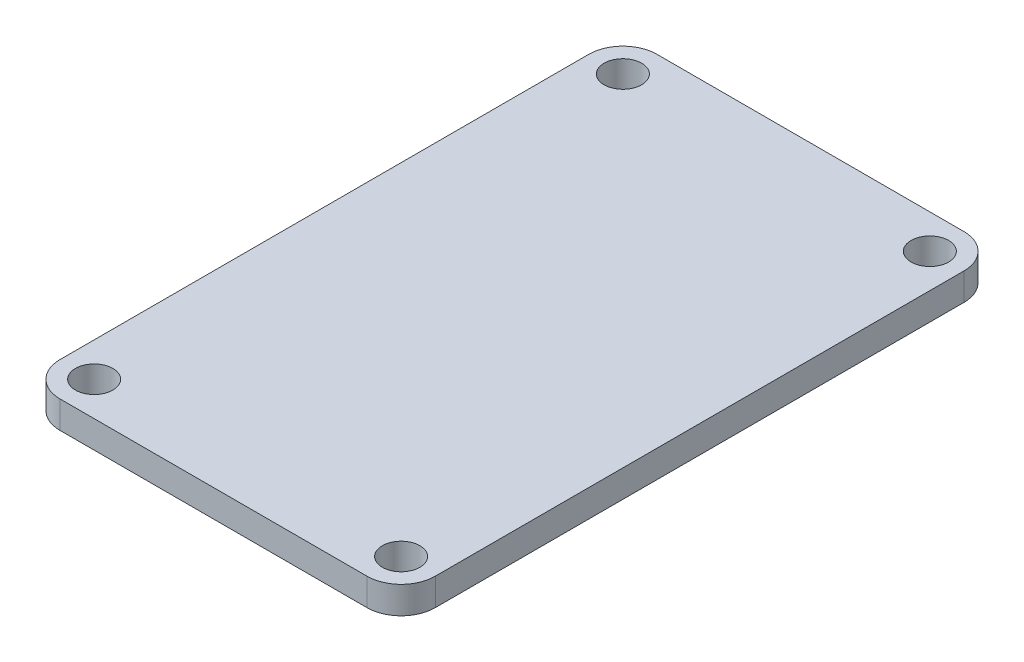
ISO-10303-21;
HEADER;
FILE_DESCRIPTION(('STEP AP214'),'2;1');
FILE_NAME('part.step','',(''),(''),'','','');
FILE_SCHEMA(('AUTOMOTIVE_DESIGN { 1 0 10303 214 1 1 1 1 }'));
ENDSEC;
DATA;
#1=APPLICATION_CONTEXT('core data for automotive mechanical design processes');
#2=APPLICATION_PROTOCOL_DEFINITION('international standard','automotive_design',2000,#1);
#3=PRODUCT_CONTEXT('',#1,'mechanical');
#4=PRODUCT('Part','Part','',(#3));
#5=PRODUCT_RELATED_PRODUCT_CATEGORY('part','',(#4));
#6=PRODUCT_DEFINITION_FORMATION('','',#4);
#7=PRODUCT_DEFINITION_CONTEXT('part definition',#1,'design');
#8=PRODUCT_DEFINITION('design','',#6,#7);
#9=PRODUCT_DEFINITION_SHAPE('','',#8);
#10=(LENGTH_UNIT() NAMED_UNIT(*) SI_UNIT(.MILLI.,.METRE.));
#11=(NAMED_UNIT(*) PLANE_ANGLE_UNIT() SI_UNIT($,.RADIAN.));
#12=(NAMED_UNIT(*) SI_UNIT($,.STERADIAN.) SOLID_ANGLE_UNIT());
#13=UNCERTAINTY_MEASURE_WITH_UNIT(LENGTH_MEASURE(1.E-05),#10,'distance_accuracy_value','');
#14=(GEOMETRIC_REPRESENTATION_CONTEXT(3) GLOBAL_UNCERTAINTY_ASSIGNED_CONTEXT((#13)) GLOBAL_UNIT_ASSIGNED_CONTEXT((#10,
#11,#12)) REPRESENTATION_CONTEXT('',''));
#15=CARTESIAN_POINT('',(0.,0.,0.));
#16=DIRECTION('',(0.,0.,1.));
#17=DIRECTION('',(1.,0.,0.));
#18=AXIS2_PLACEMENT_3D('',#15,#16,#17);
#19=CARTESIAN_POINT('',(11.,1.6,-17.5));
#20=DIRECTION('',(-1.,0.,0.));
#21=DIRECTION('',(0.,0.,1.));
#22=AXIS2_PLACEMENT_3D('',#19,#20,#21);
#23=PLANE('',#22);
#24=DIRECTION('',(0.,0.,-1.));
#25=VECTOR('',#24,1.);
#26=CARTESIAN_POINT('',(11.,0.,-17.5));
#27=LINE('',#26,#25);
#28=CARTESIAN_POINT('',(11.,0.,15.5));
#29=VERTEX_POINT('',#28);
#30=CARTESIAN_POINT('',(11.,0.,-15.5));
#31=VERTEX_POINT('',#30);
#32=EDGE_CURVE('E128',#29,#31,#27,.T.);
#33=ORIENTED_EDGE('',*,*,#32,.T.);
#34=DIRECTION('',(0.,-1.,0.));
#35=VECTOR('',#34,1.);
#36=CARTESIAN_POINT('',(11.,1.6,-15.5));
#37=LINE('',#36,#35);
#38=CARTESIAN_POINT('',(11.,1.6,-15.5));
#39=VERTEX_POINT('',#38);
#40=EDGE_CURVE('E151',#31,#39,#37,.F.);
#41=ORIENTED_EDGE('',*,*,#40,.T.);
#42=DIRECTION('',(0.,0.,-1.));
#43=VECTOR('',#42,1.);
#44=CARTESIAN_POINT('',(11.,1.6,-17.5));
#45=LINE('',#44,#43);
#46=CARTESIAN_POINT('',(11.,1.6,15.5));
#47=VERTEX_POINT('',#46);
#48=EDGE_CURVE('E126',#47,#39,#45,.T.);
#49=ORIENTED_EDGE('',*,*,#48,.F.);
#50=DIRECTION('',(0.,-1.,0.));
#51=VECTOR('',#50,1.);
#52=CARTESIAN_POINT('',(11.,1.6,15.5));
#53=LINE('',#52,#51);
#54=EDGE_CURVE('E148',#47,#29,#53,.T.);
#55=ORIENTED_EDGE('',*,*,#54,.T.);
#56=EDGE_LOOP('',(#33,#41,#49,#55));
#57=FACE_BOUND('',#56,.T.);
#58=ADVANCED_FACE('F33',(#57),#23,.F.);
#59=CARTESIAN_POINT('',(-11.,1.6,-17.5));
#60=DIRECTION('',(0.,0.,1.));
#61=DIRECTION('',(1.,0.,0.));
#62=AXIS2_PLACEMENT_3D('',#59,#60,#61);
#63=PLANE('',#62);
#64=DIRECTION('',(-1.,0.,0.));
#65=VECTOR('',#64,1.);
#66=CARTESIAN_POINT('',(-11.,0.,-17.5));
#67=LINE('',#66,#65);
#68=CARTESIAN_POINT('',(9.,0.,-17.5));
#69=VERTEX_POINT('',#68);
#70=CARTESIAN_POINT('',(-9.,0.,-17.5));
#71=VERTEX_POINT('',#70);
#72=EDGE_CURVE('E124',#69,#71,#67,.T.);
#73=ORIENTED_EDGE('',*,*,#72,.T.);
#74=DIRECTION('',(0.,-1.,0.));
#75=VECTOR('',#74,1.);
#76=CARTESIAN_POINT('',(-9.,1.6,-17.5));
#77=LINE('',#76,#75);
#78=CARTESIAN_POINT('',(-9.,1.6,-17.5));
#79=VERTEX_POINT('',#78);
#80=EDGE_CURVE('E103',#71,#79,#77,.F.);
#81=ORIENTED_EDGE('',*,*,#80,.T.);
#82=DIRECTION('',(-1.,0.,0.));
#83=VECTOR('',#82,1.);
#84=CARTESIAN_POINT('',(-11.,1.6,-17.5));
#85=LINE('',#84,#83);
#86=CARTESIAN_POINT('',(9.,1.6,-17.5));
#87=VERTEX_POINT('',#86);
#88=EDGE_CURVE('E167',#87,#79,#85,.T.);
#89=ORIENTED_EDGE('',*,*,#88,.F.);
#90=DIRECTION('',(0.,-1.,0.));
#91=VECTOR('',#90,1.);
#92=CARTESIAN_POINT('',(9.,1.6,-17.5));
#93=LINE('',#92,#91);
#94=EDGE_CURVE('E108',#87,#69,#93,.T.);
#95=ORIENTED_EDGE('',*,*,#94,.T.);
#96=EDGE_LOOP('',(#73,#81,#89,#95));
#97=FACE_BOUND('',#96,.T.);
#98=ADVANCED_FACE('F219',(#97),#63,.F.);
#99=CARTESIAN_POINT('',(-11.,1.6,-17.5));
#100=DIRECTION('',(1.,0.,0.));
#101=DIRECTION('',(0.,0.,-1.));
#102=AXIS2_PLACEMENT_3D('',#99,#100,#101);
#103=PLANE('',#102);
#104=DIRECTION('',(0.,0.,1.));
#105=VECTOR('',#104,1.);
#106=CARTESIAN_POINT('',(-11.,1.6,-17.5));
#107=LINE('',#106,#105);
#108=CARTESIAN_POINT('',(-11.,1.6,-15.5));
#109=VERTEX_POINT('',#108);
#110=CARTESIAN_POINT('',(-11.,1.6,15.5));
#111=VERTEX_POINT('',#110);
#112=EDGE_CURVE('E117',#109,#111,#107,.T.);
#113=ORIENTED_EDGE('',*,*,#112,.F.);
#114=DIRECTION('',(0.,-1.,0.));
#115=VECTOR('',#114,1.);
#116=CARTESIAN_POINT('',(-11.,1.6,-15.5));
#117=LINE('',#116,#115);
#118=CARTESIAN_POINT('',(-11.,0.,-15.5));
#119=VERTEX_POINT('',#118);
#120=EDGE_CURVE('E102',#109,#119,#117,.T.);
#121=ORIENTED_EDGE('',*,*,#120,.T.);
#122=DIRECTION('',(0.,0.,1.));
#123=VECTOR('',#122,1.);
#124=CARTESIAN_POINT('',(-11.,0.,-17.5));
#125=LINE('',#124,#123);
#126=CARTESIAN_POINT('',(-11.,0.,15.5));
#127=VERTEX_POINT('',#126);
#128=EDGE_CURVE('E115',#119,#127,#125,.T.);
#129=ORIENTED_EDGE('',*,*,#128,.T.);
#130=DIRECTION('',(0.,-1.,0.));
#131=VECTOR('',#130,1.);
#132=CARTESIAN_POINT('',(-11.,1.6,15.5));
#133=LINE('',#132,#131);
#134=EDGE_CURVE('E119',#127,#111,#133,.F.);
#135=ORIENTED_EDGE('',*,*,#134,.T.);
#136=EDGE_LOOP('',(#113,#121,#129,#135));
#137=FACE_BOUND('',#136,.T.);
#138=ADVANCED_FACE('F114',(#137),#103,.F.);
#139=CARTESIAN_POINT('',(-11.,1.6,17.5));
#140=DIRECTION('',(0.,0.,-1.));
#141=DIRECTION('',(-1.,0.,0.));
#142=AXIS2_PLACEMENT_3D('',#139,#140,#141);
#143=PLANE('',#142);
#144=DIRECTION('',(1.,0.,0.));
#145=VECTOR('',#144,1.);
#146=CARTESIAN_POINT('',(-11.,0.,17.5));
#147=LINE('',#146,#145);
#148=CARTESIAN_POINT('',(-9.,0.,17.5));
#149=VERTEX_POINT('',#148);
#150=CARTESIAN_POINT('',(9.,0.,17.5));
#151=VERTEX_POINT('',#150);
#152=EDGE_CURVE('E123',#149,#151,#147,.T.);
#153=ORIENTED_EDGE('',*,*,#152,.T.);
#154=DIRECTION('',(0.,-1.,0.));
#155=VECTOR('',#154,1.);
#156=CARTESIAN_POINT('',(9.,1.6,17.5));
#157=LINE('',#156,#155);
#158=CARTESIAN_POINT('',(9.,1.6,17.5));
#159=VERTEX_POINT('',#158);
#160=EDGE_CURVE('E11',#151,#159,#157,.F.);
#161=ORIENTED_EDGE('',*,*,#160,.T.);
#162=DIRECTION('',(1.,0.,0.));
#163=VECTOR('',#162,1.);
#164=CARTESIAN_POINT('',(-11.,1.6,17.5));
#165=LINE('',#164,#163);
#166=CARTESIAN_POINT('',(-9.,1.6,17.5));
#167=VERTEX_POINT('',#166);
#168=EDGE_CURVE('E132',#167,#159,#165,.T.);
#169=ORIENTED_EDGE('',*,*,#168,.F.);
#170=DIRECTION('',(0.,-1.,0.));
#171=VECTOR('',#170,1.);
#172=CARTESIAN_POINT('',(-9.,1.6,17.5));
#173=LINE('',#172,#171);
#174=EDGE_CURVE('E41',#167,#149,#173,.T.);
#175=ORIENTED_EDGE('',*,*,#174,.T.);
#176=EDGE_LOOP('',(#153,#161,#169,#175));
#177=FACE_BOUND('',#176,.T.);
#178=ADVANCED_FACE('F154',(#177),#143,.F.);
#179=CARTESIAN_POINT('',(0.,1.6,0.));
#180=DIRECTION('',(0.,1.,0.));
#181=DIRECTION('',(0.,0.,1.));
#182=AXIS2_PLACEMENT_3D('',#179,#180,#181);
#183=PLANE('',#182);
#184=CARTESIAN_POINT('',(-9.,1.6,15.5));
#185=DIRECTION('',(0.,1.,0.));
#186=DIRECTION('',(0.,0.,-1.));
#187=AXIS2_PLACEMENT_3D('',#184,#185,#186);
#188=CIRCLE('',#187,1.1);
#189=CARTESIAN_POINT('',(-9.,1.6,14.4));
#190=VERTEX_POINT('',#189);
#191=EDGE_CURVE('E183',#190,#190,#188,.T.);
#192=ORIENTED_EDGE('',*,*,#191,.F.);
#193=EDGE_LOOP('',(#192));
#194=FACE_BOUND('',#193,.T.);
#195=CARTESIAN_POINT('',(9.,1.6,15.5));
#196=DIRECTION('',(0.,1.,0.));
#197=DIRECTION('',(0.,0.,1.));
#198=AXIS2_PLACEMENT_3D('',#195,#196,#197);
#199=CIRCLE('',#198,1.1);
#200=CARTESIAN_POINT('',(9.,1.6,16.6));
#201=VERTEX_POINT('',#200);
#202=EDGE_CURVE('E189',#201,#201,#199,.T.);
#203=ORIENTED_EDGE('',*,*,#202,.F.);
#204=EDGE_LOOP('',(#203));
#205=FACE_BOUND('',#204,.T.);
#206=CARTESIAN_POINT('',(9.,1.6,-15.5));
#207=DIRECTION('',(0.,1.,0.));
#208=DIRECTION('',(0.,0.,-1.));
#209=AXIS2_PLACEMENT_3D('',#206,#207,#208);
#210=CIRCLE('',#209,1.1);
#211=CARTESIAN_POINT('',(9.,1.6,-16.6));
#212=VERTEX_POINT('',#211);
#213=EDGE_CURVE('E195',#212,#212,#210,.T.);
#214=ORIENTED_EDGE('',*,*,#213,.F.);
#215=EDGE_LOOP('',(#214));
#216=FACE_BOUND('',#215,.T.);
#217=CARTESIAN_POINT('',(-9.,1.6,-15.5));
#218=DIRECTION('',(0.,1.,0.));
#219=DIRECTION('',(0.,0.,1.));
#220=AXIS2_PLACEMENT_3D('',#217,#218,#219);
#221=CIRCLE('',#220,1.1);
#222=CARTESIAN_POINT('',(-9.,1.6,-14.4));
#223=VERTEX_POINT('',#222);
#224=EDGE_CURVE('E172',#223,#223,#221,.T.);
#225=ORIENTED_EDGE('',*,*,#224,.F.);
#226=EDGE_LOOP('',(#225));
#227=FACE_BOUND('',#226,.T.);
#228=ORIENTED_EDGE('',*,*,#88,.T.);
#229=CARTESIAN_POINT('',(-9.,1.6,-15.5));
#230=DIRECTION('',(0.,1.,0.));
#231=DIRECTION('',(0.,0.,1.));
#232=AXIS2_PLACEMENT_3D('',#229,#230,#231);
#233=CIRCLE('',#232,2.);
#234=EDGE_CURVE('E146',#79,#109,#233,.T.);
#235=ORIENTED_EDGE('',*,*,#234,.T.);
#236=ORIENTED_EDGE('',*,*,#112,.T.);
#237=CARTESIAN_POINT('',(-9.,1.6,15.5));
#238=DIRECTION('',(0.,1.,0.));
#239=DIRECTION('',(0.,0.,1.));
#240=AXIS2_PLACEMENT_3D('',#237,#238,#239);
#241=CIRCLE('',#240,2.);
#242=EDGE_CURVE('E53',#111,#167,#241,.T.);
#243=ORIENTED_EDGE('',*,*,#242,.T.);
#244=ORIENTED_EDGE('',*,*,#168,.T.);
#245=CARTESIAN_POINT('',(9.,1.6,15.5));
#246=DIRECTION('',(0.,1.,0.));
#247=DIRECTION('',(0.,0.,1.));
#248=AXIS2_PLACEMENT_3D('',#245,#246,#247);
#249=CIRCLE('',#248,2.);
#250=EDGE_CURVE('E142',#159,#47,#249,.T.);
#251=ORIENTED_EDGE('',*,*,#250,.T.);
#252=ORIENTED_EDGE('',*,*,#48,.T.);
#253=CARTESIAN_POINT('',(9.,1.6,-15.5));
#254=DIRECTION('',(0.,1.,0.));
#255=DIRECTION('',(0.,0.,1.));
#256=AXIS2_PLACEMENT_3D('',#253,#254,#255);
#257=CIRCLE('',#256,2.);
#258=EDGE_CURVE('E144',#39,#87,#257,.T.);
#259=ORIENTED_EDGE('',*,*,#258,.T.);
#260=EDGE_LOOP('',(#228,#235,#236,#243,#244,#251,#252,#259));
#261=FACE_BOUND('',#260,.T.);
#262=ADVANCED_FACE('F210',(#194,#205,#216,#227,#261),#183,.T.);
#263=CARTESIAN_POINT('',(0.,0.,0.));
#264=DIRECTION('',(0.,1.,0.));
#265=DIRECTION('',(0.,0.,1.));
#266=AXIS2_PLACEMENT_3D('',#263,#264,#265);
#267=PLANE('',#266);
#268=CARTESIAN_POINT('',(-9.,0.,15.5));
#269=DIRECTION('',(0.,1.,0.));
#270=DIRECTION('',(0.,0.,-1.));
#271=AXIS2_PLACEMENT_3D('',#268,#269,#270);
#272=CIRCLE('',#271,1.1);
#273=CARTESIAN_POINT('',(-9.,0.,14.4));
#274=VERTEX_POINT('',#273);
#275=EDGE_CURVE('E186',#274,#274,#272,.T.);
#276=ORIENTED_EDGE('',*,*,#275,.T.);
#277=EDGE_LOOP('',(#276));
#278=FACE_BOUND('',#277,.T.);
#279=CARTESIAN_POINT('',(9.,0.,15.5));
#280=DIRECTION('',(0.,1.,0.));
#281=DIRECTION('',(0.,0.,1.));
#282=AXIS2_PLACEMENT_3D('',#279,#280,#281);
#283=CIRCLE('',#282,1.1);
#284=CARTESIAN_POINT('',(9.,0.,16.6));
#285=VERTEX_POINT('',#284);
#286=EDGE_CURVE('E192',#285,#285,#283,.T.);
#287=ORIENTED_EDGE('',*,*,#286,.T.);
#288=EDGE_LOOP('',(#287));
#289=FACE_BOUND('',#288,.T.);
#290=CARTESIAN_POINT('',(9.,0.,-15.5));
#291=DIRECTION('',(0.,1.,0.));
#292=DIRECTION('',(0.,0.,-1.));
#293=AXIS2_PLACEMENT_3D('',#290,#291,#292);
#294=CIRCLE('',#293,1.1);
#295=CARTESIAN_POINT('',(9.,0.,-16.6));
#296=VERTEX_POINT('',#295);
#297=EDGE_CURVE('E181',#296,#296,#294,.T.);
#298=ORIENTED_EDGE('',*,*,#297,.T.);
#299=EDGE_LOOP('',(#298));
#300=FACE_BOUND('',#299,.T.);
#301=CARTESIAN_POINT('',(-9.,0.,-15.5));
#302=DIRECTION('',(0.,1.,0.));
#303=DIRECTION('',(0.,0.,1.));
#304=AXIS2_PLACEMENT_3D('',#301,#302,#303);
#305=CIRCLE('',#304,1.1);
#306=CARTESIAN_POINT('',(-9.,0.,-14.4));
#307=VERTEX_POINT('',#306);
#308=EDGE_CURVE('E176',#307,#307,#305,.T.);
#309=ORIENTED_EDGE('',*,*,#308,.T.);
#310=EDGE_LOOP('',(#309));
#311=FACE_BOUND('',#310,.T.);
#312=ORIENTED_EDGE('',*,*,#128,.F.);
#313=CARTESIAN_POINT('',(-9.,0.,-15.5));
#314=DIRECTION('',(0.,1.,0.));
#315=DIRECTION('',(0.,0.,1.));
#316=AXIS2_PLACEMENT_3D('',#313,#314,#315);
#317=CIRCLE('',#316,2.);
#318=EDGE_CURVE('E98',#119,#71,#317,.F.);
#319=ORIENTED_EDGE('',*,*,#318,.T.);
#320=ORIENTED_EDGE('',*,*,#72,.F.);
#321=CARTESIAN_POINT('',(9.,0.,-15.5));
#322=DIRECTION('',(0.,1.,0.));
#323=DIRECTION('',(0.,0.,1.));
#324=AXIS2_PLACEMENT_3D('',#321,#322,#323);
#325=CIRCLE('',#324,2.);
#326=EDGE_CURVE('E109',#69,#31,#325,.F.);
#327=ORIENTED_EDGE('',*,*,#326,.T.);
#328=ORIENTED_EDGE('',*,*,#32,.F.);
#329=CARTESIAN_POINT('',(9.,0.,15.5));
#330=DIRECTION('',(0.,1.,0.));
#331=DIRECTION('',(0.,0.,1.));
#332=AXIS2_PLACEMENT_3D('',#329,#330,#331);
#333=CIRCLE('',#332,2.);
#334=EDGE_CURVE('E135',#29,#151,#333,.F.);
#335=ORIENTED_EDGE('',*,*,#334,.T.);
#336=ORIENTED_EDGE('',*,*,#152,.F.);
#337=CARTESIAN_POINT('',(-9.,0.,15.5));
#338=DIRECTION('',(0.,1.,0.));
#339=DIRECTION('',(0.,0.,1.));
#340=AXIS2_PLACEMENT_3D('',#337,#338,#339);
#341=CIRCLE('',#340,2.);
#342=EDGE_CURVE('E118',#149,#127,#341,.F.);
#343=ORIENTED_EDGE('',*,*,#342,.T.);
#344=EDGE_LOOP('',(#312,#319,#320,#327,#328,#335,#336,#343));
#345=FACE_BOUND('',#344,.T.);
#346=ADVANCED_FACE('F121',(#278,#289,#300,#311,#345),#267,.F.);
#347=CARTESIAN_POINT('',(-9.,0.,-15.5));
#348=DIRECTION('',(0.,1.,0.));
#349=DIRECTION('',(0.,0.,1.));
#350=AXIS2_PLACEMENT_3D('',#347,#348,#349);
#351=CYLINDRICAL_SURFACE('',#350,1.1);
#352=ORIENTED_EDGE('',*,*,#308,.F.);
#353=EDGE_LOOP('',(#352));
#354=FACE_BOUND('',#353,.T.);
#355=ORIENTED_EDGE('',*,*,#224,.T.);
#356=EDGE_LOOP('',(#355));
#357=FACE_BOUND('',#356,.T.);
#358=ADVANCED_FACE('F206',(#354,#357),#351,.F.);
#359=CARTESIAN_POINT('',(9.,0.,-15.5));
#360=DIRECTION('',(0.,1.,0.));
#361=DIRECTION('',(0.,0.,1.));
#362=AXIS2_PLACEMENT_3D('',#359,#360,#361);
#363=CYLINDRICAL_SURFACE('',#362,1.1);
#364=ORIENTED_EDGE('',*,*,#297,.F.);
#365=EDGE_LOOP('',(#364));
#366=FACE_BOUND('',#365,.T.);
#367=ORIENTED_EDGE('',*,*,#213,.T.);
#368=EDGE_LOOP('',(#367));
#369=FACE_BOUND('',#368,.T.);
#370=ADVANCED_FACE('F202',(#366,#369),#363,.F.);
#371=CARTESIAN_POINT('',(9.,0.,15.5));
#372=DIRECTION('',(0.,1.,0.));
#373=DIRECTION('',(0.,0.,1.));
#374=AXIS2_PLACEMENT_3D('',#371,#372,#373);
#375=CYLINDRICAL_SURFACE('',#374,1.1);
#376=ORIENTED_EDGE('',*,*,#286,.F.);
#377=EDGE_LOOP('',(#376));
#378=FACE_BOUND('',#377,.T.);
#379=ORIENTED_EDGE('',*,*,#202,.T.);
#380=EDGE_LOOP('',(#379));
#381=FACE_BOUND('',#380,.T.);
#382=ADVANCED_FACE('F205',(#378,#381),#375,.F.);
#383=CARTESIAN_POINT('',(-9.,0.,15.5));
#384=DIRECTION('',(0.,1.,0.));
#385=DIRECTION('',(0.,0.,1.));
#386=AXIS2_PLACEMENT_3D('',#383,#384,#385);
#387=CYLINDRICAL_SURFACE('',#386,1.1);
#388=ORIENTED_EDGE('',*,*,#275,.F.);
#389=EDGE_LOOP('',(#388));
#390=FACE_BOUND('',#389,.T.);
#391=ORIENTED_EDGE('',*,*,#191,.T.);
#392=EDGE_LOOP('',(#391));
#393=FACE_BOUND('',#392,.T.);
#394=ADVANCED_FACE('F228',(#390,#393),#387,.F.);
#395=CARTESIAN_POINT('',(-9.,1.6,-15.5));
#396=DIRECTION('',(0.,-1.,0.));
#397=DIRECTION('',(0.,0.,-1.));
#398=AXIS2_PLACEMENT_3D('',#395,#396,#397);
#399=CYLINDRICAL_SURFACE('',#398,2.);
#400=ORIENTED_EDGE('',*,*,#234,.F.);
#401=ORIENTED_EDGE('',*,*,#80,.F.);
#402=ORIENTED_EDGE('',*,*,#318,.F.);
#403=ORIENTED_EDGE('',*,*,#120,.F.);
#404=EDGE_LOOP('',(#400,#401,#402,#403));
#405=FACE_BOUND('',#404,.T.);
#406=ADVANCED_FACE('F101',(#405),#399,.T.);
#407=CARTESIAN_POINT('',(9.,1.6,-15.5));
#408=DIRECTION('',(0.,-1.,0.));
#409=DIRECTION('',(0.,0.,-1.));
#410=AXIS2_PLACEMENT_3D('',#407,#408,#409);
#411=CYLINDRICAL_SURFACE('',#410,2.);
#412=ORIENTED_EDGE('',*,*,#258,.F.);
#413=ORIENTED_EDGE('',*,*,#40,.F.);
#414=ORIENTED_EDGE('',*,*,#326,.F.);
#415=ORIENTED_EDGE('',*,*,#94,.F.);
#416=EDGE_LOOP('',(#412,#413,#414,#415));
#417=FACE_BOUND('',#416,.T.);
#418=ADVANCED_FACE('F221',(#417),#411,.T.);
#419=CARTESIAN_POINT('',(9.,1.6,15.5));
#420=DIRECTION('',(0.,-1.,0.));
#421=DIRECTION('',(0.,0.,-1.));
#422=AXIS2_PLACEMENT_3D('',#419,#420,#421);
#423=CYLINDRICAL_SURFACE('',#422,2.);
#424=ORIENTED_EDGE('',*,*,#250,.F.);
#425=ORIENTED_EDGE('',*,*,#160,.F.);
#426=ORIENTED_EDGE('',*,*,#334,.F.);
#427=ORIENTED_EDGE('',*,*,#54,.F.);
#428=EDGE_LOOP('',(#424,#425,#426,#427));
#429=FACE_BOUND('',#428,.T.);
#430=ADVANCED_FACE('F161',(#429),#423,.T.);
#431=CARTESIAN_POINT('',(-9.,1.6,15.5));
#432=DIRECTION('',(0.,-1.,0.));
#433=DIRECTION('',(0.,0.,-1.));
#434=AXIS2_PLACEMENT_3D('',#431,#432,#433);
#435=CYLINDRICAL_SURFACE('',#434,2.);
#436=ORIENTED_EDGE('',*,*,#242,.F.);
#437=ORIENTED_EDGE('',*,*,#134,.F.);
#438=ORIENTED_EDGE('',*,*,#342,.F.);
#439=ORIENTED_EDGE('',*,*,#174,.F.);
#440=EDGE_LOOP('',(#436,#437,#438,#439));
#441=FACE_BOUND('',#440,.T.);
#442=ADVANCED_FACE('F35',(#441),#435,.T.);
#443=CLOSED_SHELL('',(#58,#98,#138,#178,#262,#346,#358,#370,#382,#394,#406,#418,#430,#442));
#444=MANIFOLD_SOLID_BREP('B2',#443);
#445=ADVANCED_BREP_SHAPE_REPRESENTATION('',(#18,#444),#14);
#446=SHAPE_DEFINITION_REPRESENTATION(#9,#445);
ENDSEC;
END-ISO-10303-21;
